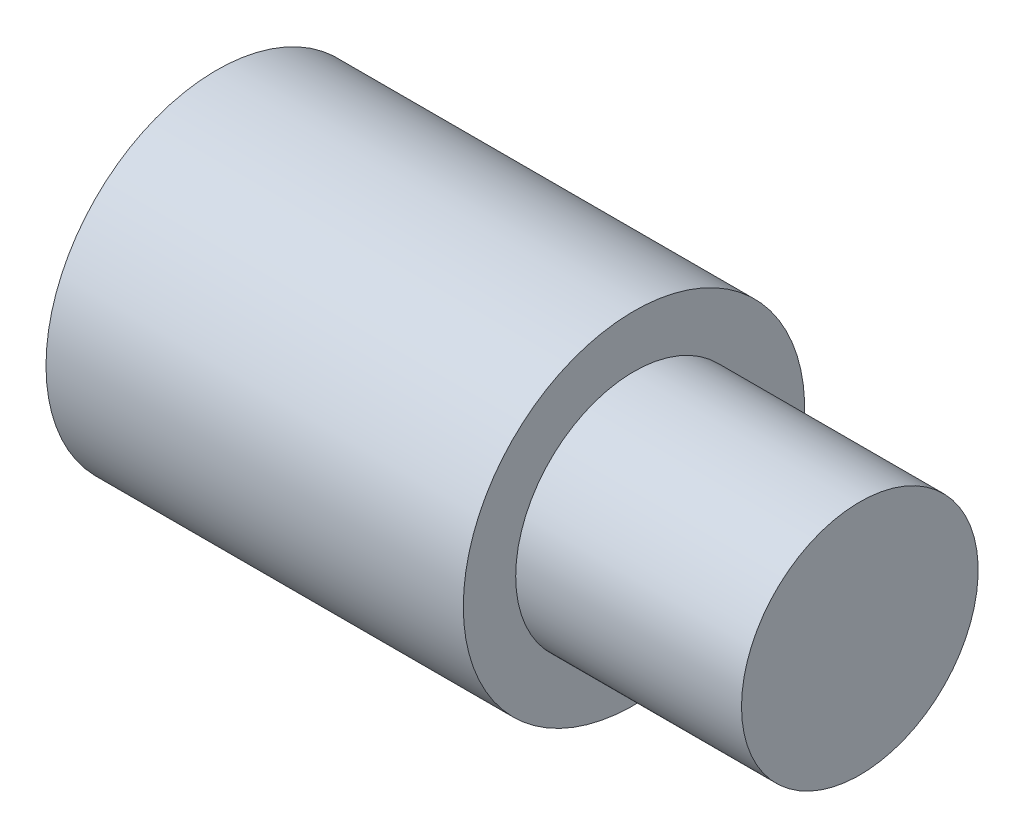
ISO-10303-21;
HEADER;
FILE_DESCRIPTION(('STEP AP214'),'2;1');
FILE_NAME('part.step','',(''),(''),'','','');
FILE_SCHEMA(('AUTOMOTIVE_DESIGN { 1 0 10303 214 1 1 1 1 }'));
ENDSEC;
DATA;
#1=APPLICATION_CONTEXT('core data for automotive mechanical design processes');
#2=APPLICATION_PROTOCOL_DEFINITION('international standard','automotive_design',2000,#1);
#3=PRODUCT_CONTEXT('',#1,'mechanical');
#4=PRODUCT('Part','Part','',(#3));
#5=PRODUCT_RELATED_PRODUCT_CATEGORY('part','',(#4));
#6=PRODUCT_DEFINITION_FORMATION('','',#4);
#7=PRODUCT_DEFINITION_CONTEXT('part definition',#1,'design');
#8=PRODUCT_DEFINITION('design','',#6,#7);
#9=PRODUCT_DEFINITION_SHAPE('','',#8);
#10=(LENGTH_UNIT() NAMED_UNIT(*) SI_UNIT(.MILLI.,.METRE.));
#11=(NAMED_UNIT(*) PLANE_ANGLE_UNIT() SI_UNIT($,.RADIAN.));
#12=(NAMED_UNIT(*) SI_UNIT($,.STERADIAN.) SOLID_ANGLE_UNIT());
#13=UNCERTAINTY_MEASURE_WITH_UNIT(LENGTH_MEASURE(1.E-05),#10,'distance_accuracy_value','');
#14=(GEOMETRIC_REPRESENTATION_CONTEXT(3) GLOBAL_UNCERTAINTY_ASSIGNED_CONTEXT((#13)) GLOBAL_UNIT_ASSIGNED_CONTEXT((#10,
#11,#12)) REPRESENTATION_CONTEXT('',''));
#15=CARTESIAN_POINT('',(0.,0.,0.));
#16=DIRECTION('',(0.,0.,1.));
#17=DIRECTION('',(1.,0.,0.));
#18=AXIS2_PLACEMENT_3D('',#15,#16,#17);
#19=CARTESIAN_POINT('',(12.5,0.,0.));
#20=DIRECTION('',(-1.,0.,0.));
#21=DIRECTION('',(0.,0.,1.));
#22=AXIS2_PLACEMENT_3D('',#19,#20,#21);
#23=PLANE('',#22);
#24=CARTESIAN_POINT('',(12.5,0.,0.));
#25=DIRECTION('',(-1.,0.,0.));
#26=DIRECTION('',(0.,0.,1.));
#27=AXIS2_PLACEMENT_3D('',#24,#25,#26);
#28=CIRCLE('',#27,6.55);
#29=CARTESIAN_POINT('',(12.5,0.,6.55));
#30=VERTEX_POINT('',#29);
#31=EDGE_CURVE('E10',#30,#30,#28,.T.);
#32=ORIENTED_EDGE('',*,*,#31,.F.);
#33=EDGE_LOOP('',(#32));
#34=FACE_BOUND('',#33,.T.);
#35=ADVANCED_FACE('F40',(#34),#23,.F.);
#36=CARTESIAN_POINT('',(-1000.,0.,0.));
#37=DIRECTION('',(-1.,0.,0.));
#38=DIRECTION('',(0.,0.,1.));
#39=AXIS2_PLACEMENT_3D('',#36,#37,#38);
#40=CYLINDRICAL_SURFACE('',#39,6.55);
#41=CARTESIAN_POINT('',(0.,0.,0.));
#42=DIRECTION('',(-1.,0.,0.));
#43=DIRECTION('',(0.,0.,1.));
#44=AXIS2_PLACEMENT_3D('',#41,#42,#43);
#45=CIRCLE('',#44,6.55);
#46=CARTESIAN_POINT('',(0.,0.,6.55));
#47=VERTEX_POINT('',#46);
#48=EDGE_CURVE('E42',#47,#47,#45,.T.);
#49=ORIENTED_EDGE('',*,*,#48,.F.);
#50=EDGE_LOOP('',(#49));
#51=FACE_BOUND('',#50,.T.);
#52=ORIENTED_EDGE('',*,*,#31,.T.);
#53=EDGE_LOOP('',(#52));
#54=FACE_BOUND('',#53,.T.);
#55=ADVANCED_FACE('F77',(#51,#54),#40,.T.);
#56=CARTESIAN_POINT('',(0.,6.55,0.));
#57=DIRECTION('',(-1.,0.,0.));
#58=DIRECTION('',(0.,0.,1.));
#59=AXIS2_PLACEMENT_3D('',#56,#57,#58);
#60=PLANE('',#59);
#61=CARTESIAN_POINT('',(0.,0.,0.));
#62=DIRECTION('',(-1.,0.,0.));
#63=DIRECTION('',(0.,0.,1.));
#64=AXIS2_PLACEMENT_3D('',#61,#62,#63);
#65=CIRCLE('',#64,9.45);
#66=CARTESIAN_POINT('',(0.,0.,9.45));
#67=VERTEX_POINT('',#66);
#68=EDGE_CURVE('E48',#67,#67,#65,.T.);
#69=ORIENTED_EDGE('',*,*,#68,.F.);
#70=EDGE_LOOP('',(#69));
#71=FACE_BOUND('',#70,.T.);
#72=ORIENTED_EDGE('',*,*,#48,.T.);
#73=EDGE_LOOP('',(#72));
#74=FACE_BOUND('',#73,.T.);
#75=ADVANCED_FACE('F74',(#71,#74),#60,.F.);
#76=CARTESIAN_POINT('',(-1000.,0.,0.));
#77=DIRECTION('',(-1.,0.,0.));
#78=DIRECTION('',(0.,0.,1.));
#79=AXIS2_PLACEMENT_3D('',#76,#77,#78);
#80=CYLINDRICAL_SURFACE('',#79,9.45);
#81=CARTESIAN_POINT('',(-23.1,0.,0.));
#82=DIRECTION('',(-1.,0.,0.));
#83=DIRECTION('',(0.,0.,1.));
#84=AXIS2_PLACEMENT_3D('',#81,#82,#83);
#85=CIRCLE('',#84,9.45);
#86=CARTESIAN_POINT('',(-23.1,0.,9.45));
#87=VERTEX_POINT('',#86);
#88=EDGE_CURVE('E52',#87,#87,#85,.T.);
#89=ORIENTED_EDGE('',*,*,#88,.F.);
#90=EDGE_LOOP('',(#89));
#91=FACE_BOUND('',#90,.T.);
#92=ORIENTED_EDGE('',*,*,#68,.T.);
#93=EDGE_LOOP('',(#92));
#94=FACE_BOUND('',#93,.T.);
#95=ADVANCED_FACE('F70',(#91,#94),#80,.T.);
#96=CARTESIAN_POINT('',(-23.1,9.45,0.));
#97=DIRECTION('',(1.,0.,0.));
#98=DIRECTION('',(0.,0.,-1.));
#99=AXIS2_PLACEMENT_3D('',#96,#97,#98);
#100=PLANE('',#99);
#101=CARTESIAN_POINT('',(-23.1,0.,0.));
#102=DIRECTION('',(1.,0.,0.));
#103=DIRECTION('',(0.,0.,-1.));
#104=AXIS2_PLACEMENT_3D('',#101,#102,#103);
#105=CIRCLE('',#104,3.175);
#106=CARTESIAN_POINT('',(-23.1,0.,-3.175));
#107=VERTEX_POINT('',#106);
#108=EDGE_CURVE('E37',#107,#107,#105,.F.);
#109=ORIENTED_EDGE('',*,*,#108,.F.);
#110=EDGE_LOOP('',(#109));
#111=FACE_BOUND('',#110,.T.);
#112=ORIENTED_EDGE('',*,*,#88,.T.);
#113=EDGE_LOOP('',(#112));
#114=FACE_BOUND('',#113,.T.);
#115=ADVANCED_FACE('F62',(#111,#114),#100,.F.);
#116=CARTESIAN_POINT('',(-1000.,0.,0.));
#117=DIRECTION('',(-1.,0.,0.));
#118=DIRECTION('',(0.,0.,1.));
#119=AXIS2_PLACEMENT_3D('',#116,#117,#118);
#120=CYLINDRICAL_SURFACE('',#119,3.175);
#121=CARTESIAN_POINT('',(-7.90000000000002,0.,0.));
#122=DIRECTION('',(-1.,0.,0.));
#123=DIRECTION('',(0.,0.,1.));
#124=AXIS2_PLACEMENT_3D('',#121,#122,#123);
#125=CIRCLE('',#124,3.175);
#126=CARTESIAN_POINT('',(-7.90000000000002,0.,3.175));
#127=VERTEX_POINT('',#126);
#128=EDGE_CURVE('E57',#127,#127,#125,.T.);
#129=ORIENTED_EDGE('',*,*,#128,.F.);
#130=EDGE_LOOP('',(#129));
#131=FACE_BOUND('',#130,.T.);
#132=ORIENTED_EDGE('',*,*,#108,.T.);
#133=EDGE_LOOP('',(#132));
#134=FACE_BOUND('',#133,.T.);
#135=ADVANCED_FACE('F65',(#131,#134),#120,.F.);
#136=CARTESIAN_POINT('',(-7.9,3.175,0.));
#137=DIRECTION('',(-1.,0.,0.));
#138=DIRECTION('',(0.,0.,1.));
#139=AXIS2_PLACEMENT_3D('',#136,#137,#138);
#140=PLANE('',#139);
#141=ORIENTED_EDGE('',*,*,#128,.T.);
#142=EDGE_LOOP('',(#141));
#143=FACE_BOUND('',#142,.T.);
#144=ADVANCED_FACE('F95',(#143),#140,.T.);
#145=CLOSED_SHELL('',(#35,#55,#75,#95,#115,#135,#144));
#146=MANIFOLD_SOLID_BREP('B2',#145);
#147=ADVANCED_BREP_SHAPE_REPRESENTATION('',(#18,#146),#14);
#148=SHAPE_DEFINITION_REPRESENTATION(#9,#147);
ENDSEC;
END-ISO-10303-21;
